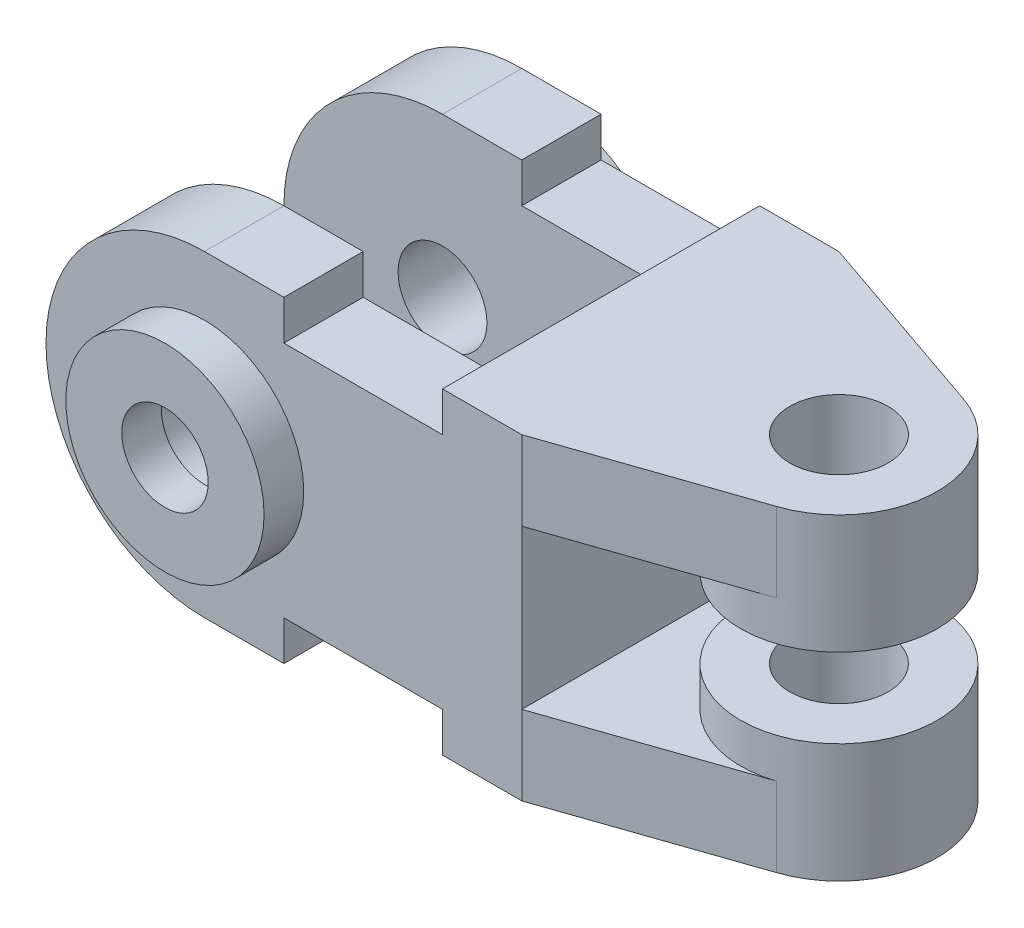
ISO-10303-21;
HEADER;
FILE_DESCRIPTION(('STEP AP214'),'2;1');
FILE_NAME('part.step','',(''),(''),'','','');
FILE_SCHEMA(('AUTOMOTIVE_DESIGN { 1 0 10303 214 1 1 1 1 }'));
ENDSEC;
DATA;
#1=APPLICATION_CONTEXT('core data for automotive mechanical design processes');
#2=APPLICATION_PROTOCOL_DEFINITION('international standard','automotive_design',2000,#1);
#3=PRODUCT_CONTEXT('',#1,'mechanical');
#4=PRODUCT('Part','Part','',(#3));
#5=PRODUCT_RELATED_PRODUCT_CATEGORY('part','',(#4));
#6=PRODUCT_DEFINITION_FORMATION('','',#4);
#7=PRODUCT_DEFINITION_CONTEXT('part definition',#1,'design');
#8=PRODUCT_DEFINITION('design','',#6,#7);
#9=PRODUCT_DEFINITION_SHAPE('','',#8);
#10=(LENGTH_UNIT() NAMED_UNIT(*) SI_UNIT(.MILLI.,.METRE.));
#11=(NAMED_UNIT(*) PLANE_ANGLE_UNIT() SI_UNIT($,.RADIAN.));
#12=(NAMED_UNIT(*) SI_UNIT($,.STERADIAN.) SOLID_ANGLE_UNIT());
#13=UNCERTAINTY_MEASURE_WITH_UNIT(LENGTH_MEASURE(1.E-05),#10,'distance_accuracy_value','');
#14=(GEOMETRIC_REPRESENTATION_CONTEXT(3) GLOBAL_UNCERTAINTY_ASSIGNED_CONTEXT((#13)) GLOBAL_UNIT_ASSIGNED_CONTEXT((#10,
#11,#12)) REPRESENTATION_CONTEXT('',''));
#15=CARTESIAN_POINT('',(0.,0.,0.));
#16=DIRECTION('',(0.,0.,1.));
#17=DIRECTION('',(1.,0.,0.));
#18=AXIS2_PLACEMENT_3D('',#15,#16,#17);
#19=CARTESIAN_POINT('',(0.,38.1,-61.375313577005));
#20=DIRECTION('',(0.,1.,0.));
#21=DIRECTION('',(-1.,0.,0.));
#22=AXIS2_PLACEMENT_3D('',#19,#20,#21);
#23=PLANE('',#22);
#24=CARTESIAN_POINT('',(41.586506056068,38.1,-0.669313577005048));
#25=DIRECTION('',(0.,-1.,0.));
#26=DIRECTION('',(1.,0.,0.));
#27=AXIS2_PLACEMENT_3D('',#24,#25,#26);
#28=CIRCLE('',#27,15.748);
#29=CARTESIAN_POINT('',(46.5529997498275,38.1,14.2750313196389));
#30=VERTEX_POINT('',#29);
#31=CARTESIAN_POINT('',(46.7129725561448,38.1,-15.5595400770819));
#32=VERTEX_POINT('',#31);
#33=EDGE_CURVE('E274',#30,#32,#28,.T.);
#34=ORIENTED_EDGE('',*,*,#33,.F.);
#35=DIRECTION('',(0.945522095075268,0.,-0.325557932977336));
#36=VECTOR('',#35,1.);
#37=CARTESIAN_POINT('',(16.186506056068,38.1,24.7306864229949));
#38=LINE('',#37,#36);
#39=CARTESIAN_POINT('',(16.186506056068,38.1,24.7306864229949));
#40=VERTEX_POINT('',#39);
#41=EDGE_CURVE('E279',#40,#30,#38,.T.);
#42=ORIENTED_EDGE('',*,*,#41,.F.);
#43=DIRECTION('',(0.,0.,1.));
#44=VECTOR('',#43,1.);
#45=CARTESIAN_POINT('',(16.186506056068,38.1,-61.375313577005));
#46=LINE('',#45,#44);
#47=CARTESIAN_POINT('',(16.186506056068,38.1,-26.0693135770051));
#48=VERTEX_POINT('',#47);
#49=EDGE_CURVE('E277',#48,#40,#46,.T.);
#50=ORIENTED_EDGE('',*,*,#49,.F.);
#51=DIRECTION('',(-0.945531273817426,0.,-0.325531273817426));
#52=VECTOR('',#51,1.);
#53=CARTESIAN_POINT('',(16.186506056068,38.1,-26.0693135770051));
#54=LINE('',#53,#52);
#55=EDGE_CURVE('E262',#32,#48,#54,.T.);
#56=ORIENTED_EDGE('',*,*,#55,.F.);
#57=EDGE_LOOP('',(#34,#42,#50,#56));
#58=FACE_BOUND('',#57,.T.);
#59=ADVANCED_FACE('F82',(#58),#23,.F.);
#60=CARTESIAN_POINT('',(0.,12.7,-61.375313577005));
#61=DIRECTION('',(0.,-1.,0.));
#62=DIRECTION('',(0.,0.,-1.));
#63=AXIS2_PLACEMENT_3D('',#60,#61,#62);
#64=PLANE('',#63);
#65=CARTESIAN_POINT('',(41.586506056068,12.7,-0.669313577005048));
#66=DIRECTION('',(0.,-1.,0.));
#67=DIRECTION('',(0.,0.,-1.));
#68=AXIS2_PLACEMENT_3D('',#65,#66,#67);
#69=CIRCLE('',#68,15.748);
#70=CARTESIAN_POINT('',(46.7129725561448,12.7,-15.5595400770819));
#71=VERTEX_POINT('',#70);
#72=CARTESIAN_POINT('',(46.5529997498267,12.7,14.2750313196391));
#73=VERTEX_POINT('',#72);
#74=EDGE_CURVE('E12',#71,#73,#69,.F.);
#75=ORIENTED_EDGE('',*,*,#74,.F.);
#76=DIRECTION('',(0.945531273817426,0.,0.325531273817426));
#77=VECTOR('',#76,1.);
#78=CARTESIAN_POINT('',(16.186506056068,12.7,-26.0693135770051));
#79=LINE('',#78,#77);
#80=CARTESIAN_POINT('',(16.186506056068,12.7,-26.0693135770051));
#81=VERTEX_POINT('',#80);
#82=EDGE_CURVE('E403',#81,#71,#79,.T.);
#83=ORIENTED_EDGE('',*,*,#82,.F.);
#84=DIRECTION('',(0.,0.,1.));
#85=VECTOR('',#84,1.);
#86=CARTESIAN_POINT('',(16.186506056068,12.7,-61.375313577005));
#87=LINE('',#86,#85);
#88=CARTESIAN_POINT('',(16.186506056068,12.7,24.7306864229949));
#89=VERTEX_POINT('',#88);
#90=EDGE_CURVE('E342',#81,#89,#87,.T.);
#91=ORIENTED_EDGE('',*,*,#90,.T.);
#92=DIRECTION('',(-0.945522095075268,0.,0.325557932977336));
#93=VECTOR('',#92,1.);
#94=CARTESIAN_POINT('',(16.186506056068,12.7,24.7306864229949));
#95=LINE('',#94,#93);
#96=EDGE_CURVE('E407',#73,#89,#95,.T.);
#97=ORIENTED_EDGE('',*,*,#96,.F.);
#98=EDGE_LOOP('',(#75,#83,#91,#97));
#99=FACE_BOUND('',#98,.T.);
#100=ADVANCED_FACE('F573',(#99),#64,.F.);
#101=CARTESIAN_POINT('',(-60.013493943932,50.8,-26.0693135770051));
#102=DIRECTION('',(0.,0.,1.));
#103=DIRECTION('',(1.,0.,0.));
#104=AXIS2_PLACEMENT_3D('',#101,#102,#103);
#105=PLANE('',#104);
#106=DIRECTION('',(-1.,0.,0.));
#107=VECTOR('',#106,1.);
#108=CARTESIAN_POINT('',(-60.013493943932,0.,-26.0693135770051));
#109=LINE('',#108,#107);
#110=CARTESIAN_POINT('',(-21.913493943932,0.,-26.0693135770051));
#111=VERTEX_POINT('',#110);
#112=CARTESIAN_POINT('',(-34.613493943932,0.,-26.0693135770051));
#113=VERTEX_POINT('',#112);
#114=EDGE_CURVE('E518',#111,#113,#109,.T.);
#115=ORIENTED_EDGE('',*,*,#114,.T.);
#116=CARTESIAN_POINT('',(-34.613493943932,25.4,-26.0693135770051));
#117=DIRECTION('',(0.,0.,1.));
#118=DIRECTION('',(1.,0.,0.));
#119=AXIS2_PLACEMENT_3D('',#116,#117,#118);
#120=CIRCLE('',#119,25.4);
#121=CARTESIAN_POINT('',(-34.613493943932,50.8,-26.0693135770051));
#122=VERTEX_POINT('',#121);
#123=EDGE_CURVE('E553',#122,#113,#120,.T.);
#124=ORIENTED_EDGE('',*,*,#123,.F.);
#125=DIRECTION('',(-1.,0.,0.));
#126=VECTOR('',#125,1.);
#127=CARTESIAN_POINT('',(-60.013493943932,50.8,-26.0693135770051));
#128=LINE('',#127,#126);
#129=CARTESIAN_POINT('',(-21.913493943932,50.8,-26.0693135770051));
#130=VERTEX_POINT('',#129);
#131=EDGE_CURVE('E487',#130,#122,#128,.T.);
#132=ORIENTED_EDGE('',*,*,#131,.F.);
#133=DIRECTION('',(0.,-1.,0.));
#134=VECTOR('',#133,1.);
#135=CARTESIAN_POINT('',(-21.913493943932,50.8,-26.0693135770051));
#136=LINE('',#135,#134);
#137=CARTESIAN_POINT('',(-21.913493943932,44.45,-26.0693135770051));
#138=VERTEX_POINT('',#137);
#139=EDGE_CURVE('E549',#130,#138,#136,.T.);
#140=ORIENTED_EDGE('',*,*,#139,.T.);
#141=DIRECTION('',(1.,0.,0.));
#142=VECTOR('',#141,1.);
#143=CARTESIAN_POINT('',(-60.013493943932,44.45,-26.0693135770051));
#144=LINE('',#143,#142);
#145=CARTESIAN_POINT('',(3.48650605606802,44.45,-26.0693135770051));
#146=VERTEX_POINT('',#145);
#147=EDGE_CURVE('E545',#138,#146,#144,.T.);
#148=ORIENTED_EDGE('',*,*,#147,.T.);
#149=DIRECTION('',(0.,1.,0.));
#150=VECTOR('',#149,1.);
#151=CARTESIAN_POINT('',(3.48650605606802,50.8,-26.0693135770051));
#152=LINE('',#151,#150);
#153=CARTESIAN_POINT('',(3.48650605606799,50.8,-26.0693135770051));
#154=VERTEX_POINT('',#153);
#155=EDGE_CURVE('E541',#146,#154,#152,.T.);
#156=ORIENTED_EDGE('',*,*,#155,.T.);
#157=CARTESIAN_POINT('',(16.186506056068,50.8,-26.0693135770051));
#158=VERTEX_POINT('',#157);
#159=EDGE_CURVE('E488',#158,#154,#128,.T.);
#160=ORIENTED_EDGE('',*,*,#159,.F.);
#161=DIRECTION('',(0.,-1.,0.));
#162=VECTOR('',#161,1.);
#163=CARTESIAN_POINT('',(16.186506056068,50.8,-26.0693135770051));
#164=LINE('',#163,#162);
#165=EDGE_CURVE('E522',#158,#48,#164,.T.);
#166=ORIENTED_EDGE('',*,*,#165,.T.);
#167=EDGE_CURVE('E524',#48,#81,#164,.T.);
#168=ORIENTED_EDGE('',*,*,#167,.T.);
#169=CARTESIAN_POINT('',(16.186506056068,0.,-26.0693135770051));
#170=VERTEX_POINT('',#169);
#171=EDGE_CURVE('E492',#81,#170,#164,.T.);
#172=ORIENTED_EDGE('',*,*,#171,.T.);
#173=CARTESIAN_POINT('',(3.48650605606803,0.,-26.0693135770051));
#174=VERTEX_POINT('',#173);
#175=EDGE_CURVE('E468',#170,#174,#109,.T.);
#176=ORIENTED_EDGE('',*,*,#175,.T.);
#177=DIRECTION('',(0.,-1.,0.));
#178=VECTOR('',#177,1.);
#179=CARTESIAN_POINT('',(3.48650605606802,50.8,-26.0693135770051));
#180=LINE('',#179,#178);
#181=CARTESIAN_POINT('',(3.48650605606802,6.35,-26.0693135770051));
#182=VERTEX_POINT('',#181);
#183=EDGE_CURVE('E331',#182,#174,#180,.T.);
#184=ORIENTED_EDGE('',*,*,#183,.F.);
#185=DIRECTION('',(1.,0.,0.));
#186=VECTOR('',#185,1.);
#187=CARTESIAN_POINT('',(-60.013493943932,6.35,-26.0693135770051));
#188=LINE('',#187,#186);
#189=CARTESIAN_POINT('',(-21.913493943932,6.35,-26.0693135770051));
#190=VERTEX_POINT('',#189);
#191=EDGE_CURVE('E556',#190,#182,#188,.T.);
#192=ORIENTED_EDGE('',*,*,#191,.F.);
#193=DIRECTION('',(0.,1.,0.));
#194=VECTOR('',#193,1.);
#195=CARTESIAN_POINT('',(-21.9134939439319,50.8,-26.0693135770051));
#196=LINE('',#195,#194);
#197=EDGE_CURVE('E559',#111,#190,#196,.T.);
#198=ORIENTED_EDGE('',*,*,#197,.F.);
#199=EDGE_LOOP('',(#115,#124,#132,#140,#148,#156,#160,#166,#168,#172,#176,#184,#192,#198));
#200=FACE_BOUND('',#199,.T.);
#201=CARTESIAN_POINT('',(-34.613493943932,25.4,-26.0693135770051));
#202=DIRECTION('',(0.,0.,1.));
#203=DIRECTION('',(1.,0.,0.));
#204=AXIS2_PLACEMENT_3D('',#201,#202,#203);
#205=CIRCLE('',#204,15.875);
#206=CARTESIAN_POINT('',(-18.738493943932,25.4,-26.0693135770051));
#207=VERTEX_POINT('',#206);
#208=EDGE_CURVE('E91',#207,#207,#205,.F.);
#209=ORIENTED_EDGE('',*,*,#208,.F.);
#210=EDGE_LOOP('',(#209));
#211=FACE_BOUND('',#210,.T.);
#212=ADVANCED_FACE('F571',(#200,#211),#105,.F.);
#213=CARTESIAN_POINT('',(-60.013493943932,50.8,-13.3693135770051));
#214=DIRECTION('',(0.,0.,-1.));
#215=DIRECTION('',(-1.,0.,0.));
#216=AXIS2_PLACEMENT_3D('',#213,#214,#215);
#217=PLANE('',#216);
#218=CARTESIAN_POINT('',(-34.613493943932,25.4,-13.369313577005));
#219=DIRECTION('',(0.,0.,-1.));
#220=DIRECTION('',(-1.,0.,0.));
#221=AXIS2_PLACEMENT_3D('',#218,#219,#220);
#222=CIRCLE('',#221,7.11200000000001);
#223=CARTESIAN_POINT('',(-41.725493943932,25.4,-13.369313577005));
#224=VERTEX_POINT('',#223);
#225=EDGE_CURVE('E450',#224,#224,#222,.T.);
#226=ORIENTED_EDGE('',*,*,#225,.T.);
#227=EDGE_LOOP('',(#226));
#228=FACE_BOUND('',#227,.T.);
#229=CARTESIAN_POINT('',(-34.613493943932,25.4,-13.369313577005));
#230=DIRECTION('',(0.,0.,-1.));
#231=DIRECTION('',(-1.,0.,0.));
#232=AXIS2_PLACEMENT_3D('',#229,#230,#231);
#233=CIRCLE('',#232,25.4);
#234=CARTESIAN_POINT('',(-34.613493943932,0.,-13.369313577005));
#235=VERTEX_POINT('',#234);
#236=CARTESIAN_POINT('',(-34.613493943932,50.8,-13.369313577005));
#237=VERTEX_POINT('',#236);
#238=EDGE_CURVE('E430',#235,#237,#233,.T.);
#239=ORIENTED_EDGE('',*,*,#238,.F.);
#240=DIRECTION('',(1.,0.,0.));
#241=VECTOR('',#240,1.);
#242=CARTESIAN_POINT('',(-60.013493943932,0.,-13.3693135770051));
#243=LINE('',#242,#241);
#244=CARTESIAN_POINT('',(-21.913493943932,0.,-13.369313577005));
#245=VERTEX_POINT('',#244);
#246=EDGE_CURVE('E459',#235,#245,#243,.T.);
#247=ORIENTED_EDGE('',*,*,#246,.T.);
#248=DIRECTION('',(0.,-1.,0.));
#249=VECTOR('',#248,1.);
#250=CARTESIAN_POINT('',(-21.9134939439319,50.8,-13.3693135770051));
#251=LINE('',#250,#249);
#252=CARTESIAN_POINT('',(-21.913493943932,6.35,-13.369313577005));
#253=VERTEX_POINT('',#252);
#254=EDGE_CURVE('E442',#253,#245,#251,.T.);
#255=ORIENTED_EDGE('',*,*,#254,.F.);
#256=DIRECTION('',(-1.,0.,0.));
#257=VECTOR('',#256,1.);
#258=CARTESIAN_POINT('',(-60.013493943932,6.35,-13.3693135770051));
#259=LINE('',#258,#257);
#260=CARTESIAN_POINT('',(3.48650605606802,6.35,-13.369313577005));
#261=VERTEX_POINT('',#260);
#262=EDGE_CURVE('E436',#261,#253,#259,.T.);
#263=ORIENTED_EDGE('',*,*,#262,.F.);
#264=DIRECTION('',(0.,-1.,0.));
#265=VECTOR('',#264,1.);
#266=CARTESIAN_POINT('',(3.48650605606803,50.8,-13.3693135770051));
#267=LINE('',#266,#265);
#268=CARTESIAN_POINT('',(3.48650605606802,44.45,-13.369313577005));
#269=VERTEX_POINT('',#268);
#270=EDGE_CURVE('E537',#269,#261,#267,.T.);
#271=ORIENTED_EDGE('',*,*,#270,.F.);
#272=DIRECTION('',(-1.,0.,0.));
#273=VECTOR('',#272,1.);
#274=CARTESIAN_POINT('',(-60.013493943932,44.45,-13.3693135770051));
#275=LINE('',#274,#273);
#276=CARTESIAN_POINT('',(-21.913493943932,44.45,-13.369313577005));
#277=VERTEX_POINT('',#276);
#278=EDGE_CURVE('E423',#269,#277,#275,.T.);
#279=ORIENTED_EDGE('',*,*,#278,.T.);
#280=DIRECTION('',(0.,1.,0.));
#281=VECTOR('',#280,1.);
#282=CARTESIAN_POINT('',(-21.913493943932,50.8,-13.3693135770051));
#283=LINE('',#282,#281);
#284=CARTESIAN_POINT('',(-21.913493943932,50.8,-13.369313577005));
#285=VERTEX_POINT('',#284);
#286=EDGE_CURVE('E415',#277,#285,#283,.T.);
#287=ORIENTED_EDGE('',*,*,#286,.T.);
#288=DIRECTION('',(1.,0.,0.));
#289=VECTOR('',#288,1.);
#290=CARTESIAN_POINT('',(-60.013493943932,50.8,-13.3693135770051));
#291=LINE('',#290,#289);
#292=EDGE_CURVE('E463',#237,#285,#291,.T.);
#293=ORIENTED_EDGE('',*,*,#292,.F.);
#294=EDGE_LOOP('',(#239,#247,#255,#263,#271,#279,#287,#293));
#295=FACE_BOUND('',#294,.T.);
#296=ADVANCED_FACE('F84',(#228,#295),#217,.F.);
#297=CARTESIAN_POINT('',(-60.013493943932,50.8,12.0306864229949));
#298=DIRECTION('',(0.,0.,1.));
#299=DIRECTION('',(1.,0.,0.));
#300=AXIS2_PLACEMENT_3D('',#297,#298,#299);
#301=PLANE('',#300);
#302=CARTESIAN_POINT('',(-34.613493943932,25.4,12.0306864229949));
#303=DIRECTION('',(0.,0.,1.));
#304=DIRECTION('',(1.,0.,0.));
#305=AXIS2_PLACEMENT_3D('',#302,#303,#304);
#306=CIRCLE('',#305,7.11200000000001);
#307=CARTESIAN_POINT('',(-27.501493943932,25.4,12.0306864229949));
#308=VERTEX_POINT('',#307);
#309=EDGE_CURVE('E446',#308,#308,#306,.T.);
#310=ORIENTED_EDGE('',*,*,#309,.T.);
#311=EDGE_LOOP('',(#310));
#312=FACE_BOUND('',#311,.T.);
#313=DIRECTION('',(-1.,0.,0.));
#314=VECTOR('',#313,1.);
#315=CARTESIAN_POINT('',(-60.013493943932,0.,12.0306864229949));
#316=LINE('',#315,#314);
#317=CARTESIAN_POINT('',(-21.913493943932,0.,12.0306864229949));
#318=VERTEX_POINT('',#317);
#319=CARTESIAN_POINT('',(-34.613493943932,0.,12.0306864229949));
#320=VERTEX_POINT('',#319);
#321=EDGE_CURVE('E498',#318,#320,#316,.T.);
#322=ORIENTED_EDGE('',*,*,#321,.T.);
#323=CARTESIAN_POINT('',(-34.613493943932,25.4,12.0306864229949));
#324=DIRECTION('',(0.,0.,1.));
#325=DIRECTION('',(1.,0.,0.));
#326=AXIS2_PLACEMENT_3D('',#323,#324,#325);
#327=CIRCLE('',#326,25.4);
#328=CARTESIAN_POINT('',(-34.613493943932,50.8,12.0306864229949));
#329=VERTEX_POINT('',#328);
#330=EDGE_CURVE('E427',#329,#320,#327,.T.);
#331=ORIENTED_EDGE('',*,*,#330,.F.);
#332=DIRECTION('',(-1.,0.,0.));
#333=VECTOR('',#332,1.);
#334=CARTESIAN_POINT('',(-60.013493943932,50.8,12.0306864229949));
#335=LINE('',#334,#333);
#336=CARTESIAN_POINT('',(-21.913493943932,50.8,12.0306864229949));
#337=VERTEX_POINT('',#336);
#338=EDGE_CURVE('E471',#337,#329,#335,.T.);
#339=ORIENTED_EDGE('',*,*,#338,.F.);
#340=DIRECTION('',(0.,-1.,0.));
#341=VECTOR('',#340,1.);
#342=CARTESIAN_POINT('',(-21.913493943932,50.8,12.0306864229949));
#343=LINE('',#342,#341);
#344=CARTESIAN_POINT('',(-21.913493943932,44.45,12.0306864229949));
#345=VERTEX_POINT('',#344);
#346=EDGE_CURVE('E411',#337,#345,#343,.T.);
#347=ORIENTED_EDGE('',*,*,#346,.T.);
#348=DIRECTION('',(1.,0.,0.));
#349=VECTOR('',#348,1.);
#350=CARTESIAN_POINT('',(-60.013493943932,44.45,12.0306864229949));
#351=LINE('',#350,#349);
#352=CARTESIAN_POINT('',(3.48650605606802,44.45,12.0306864229949));
#353=VERTEX_POINT('',#352);
#354=EDGE_CURVE('E419',#345,#353,#351,.T.);
#355=ORIENTED_EDGE('',*,*,#354,.T.);
#356=DIRECTION('',(0.,-1.,0.));
#357=VECTOR('',#356,1.);
#358=CARTESIAN_POINT('',(3.48650605606803,50.8,12.0306864229949));
#359=LINE('',#358,#357);
#360=CARTESIAN_POINT('',(3.48650605606802,6.35,12.0306864229949));
#361=VERTEX_POINT('',#360);
#362=EDGE_CURVE('E533',#353,#361,#359,.T.);
#363=ORIENTED_EDGE('',*,*,#362,.T.);
#364=DIRECTION('',(1.,0.,0.));
#365=VECTOR('',#364,1.);
#366=CARTESIAN_POINT('',(-60.013493943932,6.35,12.0306864229949));
#367=LINE('',#366,#365);
#368=CARTESIAN_POINT('',(-21.913493943932,6.35,12.0306864229949));
#369=VERTEX_POINT('',#368);
#370=EDGE_CURVE('E433',#369,#361,#367,.T.);
#371=ORIENTED_EDGE('',*,*,#370,.F.);
#372=DIRECTION('',(0.,1.,0.));
#373=VECTOR('',#372,1.);
#374=CARTESIAN_POINT('',(-21.9134939439319,50.8,12.0306864229949));
#375=LINE('',#374,#373);
#376=EDGE_CURVE('E439',#318,#369,#375,.T.);
#377=ORIENTED_EDGE('',*,*,#376,.F.);
#378=EDGE_LOOP('',(#322,#331,#339,#347,#355,#363,#371,#377));
#379=FACE_BOUND('',#378,.T.);
#380=ADVANCED_FACE('F580',(#312,#379),#301,.F.);
#381=CARTESIAN_POINT('',(-60.013493943932,50.8,24.7306864229949));
#382=DIRECTION('',(0.,0.,-1.));
#383=DIRECTION('',(-1.,0.,0.));
#384=AXIS2_PLACEMENT_3D('',#381,#382,#383);
#385=PLANE('',#384);
#386=CARTESIAN_POINT('',(-34.613493943932,25.4,24.7306864229949));
#387=DIRECTION('',(0.,0.,1.));
#388=DIRECTION('',(1.,0.,0.));
#389=AXIS2_PLACEMENT_3D('',#386,#387,#388);
#390=CIRCLE('',#389,15.875);
#391=CARTESIAN_POINT('',(-18.738493943932,25.4,24.7306864229949));
#392=VERTEX_POINT('',#391);
#393=EDGE_CURVE('E327',#392,#392,#390,.T.);
#394=ORIENTED_EDGE('',*,*,#393,.F.);
#395=EDGE_LOOP('',(#394));
#396=FACE_BOUND('',#395,.T.);
#397=CARTESIAN_POINT('',(-34.613493943932,25.4,24.7306864229949));
#398=DIRECTION('',(0.,0.,1.));
#399=DIRECTION('',(1.,0.,0.));
#400=AXIS2_PLACEMENT_3D('',#397,#398,#399);
#401=CIRCLE('',#400,25.4);
#402=CARTESIAN_POINT('',(-34.613493943932,50.8,24.7306864229949));
#403=VERTEX_POINT('',#402);
#404=CARTESIAN_POINT('',(-34.613493943932,0.,24.7306864229949));
#405=VERTEX_POINT('',#404);
#406=EDGE_CURVE('E347',#403,#405,#401,.T.);
#407=ORIENTED_EDGE('',*,*,#406,.T.);
#408=DIRECTION('',(1.,0.,0.));
#409=VECTOR('',#408,1.);
#410=CARTESIAN_POINT('',(-60.013493943932,0.,24.7306864229949));
#411=LINE('',#410,#409);
#412=CARTESIAN_POINT('',(-21.913493943932,0.,24.7306864229949));
#413=VERTEX_POINT('',#412);
#414=EDGE_CURVE('E503',#405,#413,#411,.T.);
#415=ORIENTED_EDGE('',*,*,#414,.T.);
#416=DIRECTION('',(0.,1.,0.));
#417=VECTOR('',#416,1.);
#418=CARTESIAN_POINT('',(-21.913493943932,0.,24.7306864229949));
#419=LINE('',#418,#417);
#420=CARTESIAN_POINT('',(-21.913493943932,6.35,24.7306864229949));
#421=VERTEX_POINT('',#420);
#422=EDGE_CURVE('E363',#413,#421,#419,.T.);
#423=ORIENTED_EDGE('',*,*,#422,.T.);
#424=DIRECTION('',(1.,0.,0.));
#425=VECTOR('',#424,1.);
#426=CARTESIAN_POINT('',(0.,6.35,24.7306864229949));
#427=LINE('',#426,#425);
#428=CARTESIAN_POINT('',(3.48650605606803,6.35,24.7306864229949));
#429=VERTEX_POINT('',#428);
#430=EDGE_CURVE('E359',#421,#429,#427,.T.);
#431=ORIENTED_EDGE('',*,*,#430,.T.);
#432=DIRECTION('',(0.,-1.,0.));
#433=VECTOR('',#432,1.);
#434=CARTESIAN_POINT('',(3.48650605606803,0.,24.7306864229949));
#435=LINE('',#434,#433);
#436=CARTESIAN_POINT('',(3.48650605606803,0.,24.7306864229949));
#437=VERTEX_POINT('',#436);
#438=EDGE_CURVE('E98',#429,#437,#435,.T.);
#439=ORIENTED_EDGE('',*,*,#438,.T.);
#440=CARTESIAN_POINT('',(16.186506056068,0.,24.7306864229949));
#441=VERTEX_POINT('',#440);
#442=EDGE_CURVE('E502',#437,#441,#411,.T.);
#443=ORIENTED_EDGE('',*,*,#442,.T.);
#444=DIRECTION('',(0.,-1.,0.));
#445=VECTOR('',#444,1.);
#446=CARTESIAN_POINT('',(16.186506056068,50.8,24.7306864229949));
#447=LINE('',#446,#445);
#448=EDGE_CURVE('E528',#89,#441,#447,.T.);
#449=ORIENTED_EDGE('',*,*,#448,.F.);
#450=DIRECTION('',(0.,1.,0.));
#451=VECTOR('',#450,1.);
#452=CARTESIAN_POINT('',(16.186506056068,0.,24.7306864229949));
#453=LINE('',#452,#451);
#454=EDGE_CURVE('E337',#89,#40,#453,.T.);
#455=ORIENTED_EDGE('',*,*,#454,.T.);
#456=CARTESIAN_POINT('',(16.186506056068,50.8,24.7306864229949));
#457=VERTEX_POINT('',#456);
#458=EDGE_CURVE('E529',#457,#40,#447,.T.);
#459=ORIENTED_EDGE('',*,*,#458,.F.);
#460=DIRECTION('',(1.,0.,0.));
#461=VECTOR('',#460,1.);
#462=CARTESIAN_POINT('',(-60.013493943932,50.8,24.7306864229949));
#463=LINE('',#462,#461);
#464=CARTESIAN_POINT('',(3.48650605606802,50.8,24.7306864229949));
#465=VERTEX_POINT('',#464);
#466=EDGE_CURVE('E475',#465,#457,#463,.T.);
#467=ORIENTED_EDGE('',*,*,#466,.F.);
#468=DIRECTION('',(0.,1.,0.));
#469=VECTOR('',#468,1.);
#470=CARTESIAN_POINT('',(3.48650605606803,0.,24.7306864229949));
#471=LINE('',#470,#469);
#472=CARTESIAN_POINT('',(3.48650605606803,44.45,24.7306864229949));
#473=VERTEX_POINT('',#472);
#474=EDGE_CURVE('E382',#473,#465,#471,.T.);
#475=ORIENTED_EDGE('',*,*,#474,.F.);
#476=DIRECTION('',(1.,0.,0.));
#477=VECTOR('',#476,1.);
#478=CARTESIAN_POINT('',(0.,44.45,24.7306864229949));
#479=LINE('',#478,#477);
#480=CARTESIAN_POINT('',(-21.913493943932,44.45,24.7306864229949));
#481=VERTEX_POINT('',#480);
#482=EDGE_CURVE('E106',#481,#473,#479,.T.);
#483=ORIENTED_EDGE('',*,*,#482,.F.);
#484=DIRECTION('',(0.,-1.,0.));
#485=VECTOR('',#484,1.);
#486=CARTESIAN_POINT('',(-21.913493943932,0.,24.7306864229949));
#487=LINE('',#486,#485);
#488=CARTESIAN_POINT('',(-21.913493943932,50.8,24.7306864229949));
#489=VERTEX_POINT('',#488);
#490=EDGE_CURVE('E386',#489,#481,#487,.T.);
#491=ORIENTED_EDGE('',*,*,#490,.F.);
#492=EDGE_CURVE('E478',#403,#489,#463,.T.);
#493=ORIENTED_EDGE('',*,*,#492,.F.);
#494=EDGE_LOOP('',(#407,#415,#423,#431,#439,#443,#449,#455,#459,#467,#475,#483,#491,#493));
#495=FACE_BOUND('',#494,.T.);
#496=ADVANCED_FACE('F672',(#396,#495),#385,.F.);
#497=CARTESIAN_POINT('',(41.586506056068,50.8,-0.669313577005048));
#498=DIRECTION('',(0.,-1.,0.));
#499=DIRECTION('',(0.,0.,-1.));
#500=AXIS2_PLACEMENT_3D('',#497,#498,#499);
#501=PLANE('',#500);
#502=ORIENTED_EDGE('',*,*,#131,.T.);
#503=DIRECTION('',(0.,0.,1.));
#504=VECTOR('',#503,1.);
#505=CARTESIAN_POINT('',(-34.613493943932,50.8,-61.375313577005));
#506=LINE('',#505,#504);
#507=EDGE_CURVE('E341',#122,#237,#506,.T.);
#508=ORIENTED_EDGE('',*,*,#507,.T.);
#509=ORIENTED_EDGE('',*,*,#292,.T.);
#510=DIRECTION('',(0.,0.,1.));
#511=VECTOR('',#510,1.);
#512=CARTESIAN_POINT('',(-21.913493943932,50.8,-61.375313577005));
#513=LINE('',#512,#511);
#514=EDGE_CURVE('E394',#130,#285,#513,.T.);
#515=ORIENTED_EDGE('',*,*,#514,.F.);
#516=EDGE_LOOP('',(#502,#508,#509,#515));
#517=FACE_BOUND('',#516,.T.);
#518=ADVANCED_FACE('F633',(#517),#501,.F.);
#519=ORIENTED_EDGE('',*,*,#338,.T.);
#520=EDGE_CURVE('E350',#329,#403,#506,.T.);
#521=ORIENTED_EDGE('',*,*,#520,.T.);
#522=ORIENTED_EDGE('',*,*,#492,.T.);
#523=EDGE_CURVE('E395',#337,#489,#513,.T.);
#524=ORIENTED_EDGE('',*,*,#523,.F.);
#525=EDGE_LOOP('',(#519,#521,#522,#524));
#526=FACE_BOUND('',#525,.T.);
#527=ADVANCED_FACE('F634',(#526),#501,.F.);
#528=CARTESIAN_POINT('',(41.586506056068,0.,-0.669313577005048));
#529=DIRECTION('',(0.,-1.,0.));
#530=DIRECTION('',(0.,0.,-1.));
#531=AXIS2_PLACEMENT_3D('',#528,#529,#530);
#532=PLANE('',#531);
#533=CARTESIAN_POINT('',(41.586506056068,0.,-0.669313577005048));
#534=DIRECTION('',(0.,1.,0.));
#535=DIRECTION('',(0.,0.,1.));
#536=AXIS2_PLACEMENT_3D('',#533,#534,#535);
#537=CIRCLE('',#536,7.874);
#538=CARTESIAN_POINT('',(41.586506056068,0.,7.20468642299495));
#539=VERTEX_POINT('',#538);
#540=EDGE_CURVE('E454',#539,#539,#537,.T.);
#541=ORIENTED_EDGE('',*,*,#540,.T.);
#542=EDGE_LOOP('',(#541));
#543=FACE_BOUND('',#542,.T.);
#544=ORIENTED_EDGE('',*,*,#442,.F.);
#545=DIRECTION('',(0.,0.,1.));
#546=VECTOR('',#545,1.);
#547=CARTESIAN_POINT('',(3.48650605606803,0.,-13.3693135770051));
#548=LINE('',#547,#546);
#549=EDGE_CURVE('E495',#174,#437,#548,.T.);
#550=ORIENTED_EDGE('',*,*,#549,.F.);
#551=ORIENTED_EDGE('',*,*,#175,.F.);
#552=DIRECTION('',(-0.945531273817426,0.,-0.325531273817426));
#553=VECTOR('',#552,1.);
#554=CARTESIAN_POINT('',(16.186506056068,0.,-26.0693135770051));
#555=LINE('',#554,#553);
#556=CARTESIAN_POINT('',(46.7129725561448,0.,-15.5595400770819));
#557=VERTEX_POINT('',#556);
#558=EDGE_CURVE('E514',#557,#170,#555,.T.);
#559=ORIENTED_EDGE('',*,*,#558,.F.);
#560=CARTESIAN_POINT('',(41.586506056068,0.,-0.669313577005048));
#561=DIRECTION('',(0.,1.,0.));
#562=DIRECTION('',(0.,0.,-1.));
#563=AXIS2_PLACEMENT_3D('',#560,#561,#562);
#564=CIRCLE('',#563,15.748);
#565=CARTESIAN_POINT('',(46.5529997498275,0.,14.2750313196389));
#566=VERTEX_POINT('',#565);
#567=EDGE_CURVE('E510',#566,#557,#564,.T.);
#568=ORIENTED_EDGE('',*,*,#567,.F.);
#569=DIRECTION('',(0.945522095075268,0.,-0.325557932977336));
#570=VECTOR('',#569,1.);
#571=CARTESIAN_POINT('',(16.186506056068,0.,24.7306864229949));
#572=LINE('',#571,#570);
#573=EDGE_CURVE('E506',#441,#566,#572,.T.);
#574=ORIENTED_EDGE('',*,*,#573,.F.);
#575=EDGE_LOOP('',(#544,#550,#551,#559,#568,#574));
#576=FACE_BOUND('',#575,.T.);
#577=ADVANCED_FACE('F635',(#543,#576),#532,.T.);
#578=DIRECTION('',(0.,0.,1.));
#579=VECTOR('',#578,1.);
#580=CARTESIAN_POINT('',(-34.613493943932,0.,-61.375313577005));
#581=LINE('',#580,#579);
#582=EDGE_CURVE('E336',#113,#235,#581,.T.);
#583=ORIENTED_EDGE('',*,*,#582,.F.);
#584=ORIENTED_EDGE('',*,*,#114,.F.);
#585=DIRECTION('',(0.,0.,1.));
#586=VECTOR('',#585,1.);
#587=CARTESIAN_POINT('',(-21.913493943932,0.,-61.375313577005));
#588=LINE('',#587,#586);
#589=EDGE_CURVE('E372',#111,#245,#588,.T.);
#590=ORIENTED_EDGE('',*,*,#589,.T.);
#591=ORIENTED_EDGE('',*,*,#246,.F.);
#592=EDGE_LOOP('',(#583,#584,#590,#591));
#593=FACE_BOUND('',#592,.T.);
#594=ADVANCED_FACE('F637',(#593),#532,.T.);
#595=EDGE_CURVE('E332',#320,#405,#581,.T.);
#596=ORIENTED_EDGE('',*,*,#595,.F.);
#597=ORIENTED_EDGE('',*,*,#321,.F.);
#598=EDGE_CURVE('E368',#318,#413,#588,.T.);
#599=ORIENTED_EDGE('',*,*,#598,.T.);
#600=ORIENTED_EDGE('',*,*,#414,.F.);
#601=EDGE_LOOP('',(#596,#597,#599,#600));
#602=FACE_BOUND('',#601,.T.);
#603=ADVANCED_FACE('F639',(#602),#532,.T.);
#604=CARTESIAN_POINT('',(16.186506056068,50.8,24.7306864229949));
#605=DIRECTION('',(-0.325557932977336,0.,-0.945522095075268));
#606=DIRECTION('',(-0.945522095075268,0.,0.325557932977336));
#607=AXIS2_PLACEMENT_3D('',#604,#605,#606);
#608=PLANE('',#607);
#609=DIRECTION('',(0.,-1.,0.));
#610=VECTOR('',#609,1.);
#611=CARTESIAN_POINT('',(46.5529997498275,50.8,14.2750313196389));
#612=LINE('',#611,#610);
#613=EDGE_CURVE('E269',#73,#566,#612,.T.);
#614=ORIENTED_EDGE('',*,*,#613,.F.);
#615=ORIENTED_EDGE('',*,*,#96,.T.);
#616=ORIENTED_EDGE('',*,*,#448,.T.);
#617=ORIENTED_EDGE('',*,*,#573,.T.);
#618=EDGE_LOOP('',(#614,#615,#616,#617));
#619=FACE_BOUND('',#618,.T.);
#620=ADVANCED_FACE('F648',(#619),#608,.F.);
#621=CARTESIAN_POINT('',(41.586506056068,50.8,-0.669313577005048));
#622=DIRECTION('',(0.,-1.,0.));
#623=DIRECTION('',(0.,0.,-1.));
#624=AXIS2_PLACEMENT_3D('',#621,#622,#623);
#625=CYLINDRICAL_SURFACE('',#624,15.748);
#626=DIRECTION('',(0.,-1.,0.));
#627=VECTOR('',#626,1.);
#628=CARTESIAN_POINT('',(46.7129725561448,50.8,-15.5595400770819));
#629=LINE('',#628,#627);
#630=EDGE_CURVE('E270',#71,#557,#629,.T.);
#631=ORIENTED_EDGE('',*,*,#630,.F.);
#632=ORIENTED_EDGE('',*,*,#74,.T.);
#633=ORIENTED_EDGE('',*,*,#613,.T.);
#634=ORIENTED_EDGE('',*,*,#567,.T.);
#635=EDGE_LOOP('',(#631,#632,#633,#634));
#636=FACE_BOUND('',#635,.T.);
#637=CARTESIAN_POINT('',(41.586506056068,19.05,-0.669313577005048));
#638=DIRECTION('',(0.,1.,0.));
#639=DIRECTION('',(0.,0.,1.));
#640=AXIS2_PLACEMENT_3D('',#637,#638,#639);
#641=CIRCLE('',#640,15.748);
#642=CARTESIAN_POINT('',(41.586506056068,19.05,15.078686422995));
#643=VERTEX_POINT('',#642);
#644=EDGE_CURVE('E302',#643,#643,#641,.T.);
#645=ORIENTED_EDGE('',*,*,#644,.F.);
#646=EDGE_LOOP('',(#645));
#647=FACE_BOUND('',#646,.T.);
#648=ADVANCED_FACE('F653',(#636,#647),#625,.T.);
#649=CARTESIAN_POINT('',(16.186506056068,50.8,-26.0693135770051));
#650=DIRECTION('',(-0.325531273817426,0.,0.945531273817426));
#651=DIRECTION('',(0.945531273817426,0.,0.325531273817426));
#652=AXIS2_PLACEMENT_3D('',#649,#650,#651);
#653=PLANE('',#652);
#654=ORIENTED_EDGE('',*,*,#171,.F.);
#655=ORIENTED_EDGE('',*,*,#82,.T.);
#656=ORIENTED_EDGE('',*,*,#630,.T.);
#657=ORIENTED_EDGE('',*,*,#558,.T.);
#658=EDGE_LOOP('',(#654,#655,#656,#657));
#659=FACE_BOUND('',#658,.T.);
#660=ADVANCED_FACE('F766',(#659),#653,.F.);
#661=CARTESIAN_POINT('',(41.586506056068,50.8,-0.669313577005048));
#662=DIRECTION('',(0.,-1.,0.));
#663=DIRECTION('',(0.,0.,-1.));
#664=AXIS2_PLACEMENT_3D('',#661,#662,#663);
#665=CYLINDRICAL_SURFACE('',#664,7.874);
#666=ORIENTED_EDGE('',*,*,#540,.F.);
#667=EDGE_LOOP('',(#666));
#668=FACE_BOUND('',#667,.T.);
#669=CARTESIAN_POINT('',(41.586506056068,19.05,-0.669313577005048));
#670=DIRECTION('',(0.,1.,0.));
#671=DIRECTION('',(0.,0.,1.));
#672=AXIS2_PLACEMENT_3D('',#669,#670,#671);
#673=CIRCLE('',#672,7.874);
#674=CARTESIAN_POINT('',(41.586506056068,19.05,7.20468642299495));
#675=VERTEX_POINT('',#674);
#676=EDGE_CURVE('E294',#675,#675,#673,.T.);
#677=ORIENTED_EDGE('',*,*,#676,.T.);
#678=EDGE_LOOP('',(#677));
#679=FACE_BOUND('',#678,.T.);
#680=ADVANCED_FACE('F628',(#668,#679),#665,.F.);
#681=ORIENTED_EDGE('',*,*,#159,.T.);
#682=DIRECTION('',(0.,0.,1.));
#683=VECTOR('',#682,1.);
#684=CARTESIAN_POINT('',(3.48650605606803,50.8,-13.3693135770051));
#685=LINE('',#684,#683);
#686=EDGE_CURVE('E467',#154,#465,#685,.T.);
#687=ORIENTED_EDGE('',*,*,#686,.T.);
#688=ORIENTED_EDGE('',*,*,#466,.T.);
#689=DIRECTION('',(0.945522095075268,0.,-0.325557932977336));
#690=VECTOR('',#689,1.);
#691=CARTESIAN_POINT('',(16.186506056068,50.8,24.7306864229949));
#692=LINE('',#691,#690);
#693=CARTESIAN_POINT('',(46.5529997498275,50.8,14.2750313196389));
#694=VERTEX_POINT('',#693);
#695=EDGE_CURVE('E479',#457,#694,#692,.T.);
#696=ORIENTED_EDGE('',*,*,#695,.T.);
#697=CARTESIAN_POINT('',(41.586506056068,50.8,-0.669313577005048));
#698=DIRECTION('',(0.,1.,0.));
#699=DIRECTION('',(0.,0.,-1.));
#700=AXIS2_PLACEMENT_3D('',#697,#698,#699);
#701=CIRCLE('',#700,15.748);
#702=CARTESIAN_POINT('',(46.7129725561448,50.8,-15.5595400770819));
#703=VERTEX_POINT('',#702);
#704=EDGE_CURVE('E482',#694,#703,#701,.T.);
#705=ORIENTED_EDGE('',*,*,#704,.T.);
#706=DIRECTION('',(-0.945531273817426,0.,-0.325531273817426));
#707=VECTOR('',#706,1.);
#708=CARTESIAN_POINT('',(16.186506056068,50.8,-26.0693135770051));
#709=LINE('',#708,#707);
#710=EDGE_CURVE('E264',#703,#158,#709,.T.);
#711=ORIENTED_EDGE('',*,*,#710,.T.);
#712=EDGE_LOOP('',(#681,#687,#688,#696,#705,#711));
#713=FACE_BOUND('',#712,.T.);
#714=CARTESIAN_POINT('',(41.586506056068,50.8,-0.669313577005048));
#715=DIRECTION('',(0.,1.,0.));
#716=DIRECTION('',(0.,0.,1.));
#717=AXIS2_PLACEMENT_3D('',#714,#715,#716);
#718=CIRCLE('',#717,7.874);
#719=CARTESIAN_POINT('',(41.586506056068,50.8,7.20468642299495));
#720=VERTEX_POINT('',#719);
#721=EDGE_CURVE('E455',#720,#720,#718,.T.);
#722=ORIENTED_EDGE('',*,*,#721,.F.);
#723=EDGE_LOOP('',(#722));
#724=FACE_BOUND('',#723,.T.);
#725=ADVANCED_FACE('F629',(#713,#724),#501,.F.);
#726=CARTESIAN_POINT('',(3.48650605606803,50.8,-13.3693135770051));
#727=DIRECTION('',(1.,0.,0.));
#728=DIRECTION('',(0.,0.,-1.));
#729=AXIS2_PLACEMENT_3D('',#726,#727,#728);
#730=PLANE('',#729);
#731=ORIENTED_EDGE('',*,*,#549,.T.);
#732=ORIENTED_EDGE('',*,*,#438,.F.);
#733=DIRECTION('',(0.,0.,1.));
#734=VECTOR('',#733,1.);
#735=CARTESIAN_POINT('',(3.48650605606802,6.35,-61.375313577005));
#736=LINE('',#735,#734);
#737=EDGE_CURVE('E367',#361,#429,#736,.T.);
#738=ORIENTED_EDGE('',*,*,#737,.F.);
#739=ORIENTED_EDGE('',*,*,#362,.F.);
#740=DIRECTION('',(0.,0.,1.));
#741=VECTOR('',#740,1.);
#742=CARTESIAN_POINT('',(3.48650605606802,44.45,-61.375313577005));
#743=LINE('',#742,#741);
#744=EDGE_CURVE('E390',#353,#473,#743,.T.);
#745=ORIENTED_EDGE('',*,*,#744,.T.);
#746=ORIENTED_EDGE('',*,*,#474,.T.);
#747=ORIENTED_EDGE('',*,*,#686,.F.);
#748=ORIENTED_EDGE('',*,*,#155,.F.);
#749=EDGE_CURVE('E398',#146,#269,#743,.T.);
#750=ORIENTED_EDGE('',*,*,#749,.T.);
#751=ORIENTED_EDGE('',*,*,#270,.T.);
#752=EDGE_CURVE('E377',#182,#261,#736,.T.);
#753=ORIENTED_EDGE('',*,*,#752,.F.);
#754=ORIENTED_EDGE('',*,*,#183,.T.);
#755=EDGE_LOOP('',(#731,#732,#738,#739,#745,#746,#747,#748,#750,#751,#753,#754));
#756=FACE_BOUND('',#755,.T.);
#757=ADVANCED_FACE('F631',(#756),#730,.F.);
#758=ORIENTED_EDGE('',*,*,#458,.T.);
#759=ORIENTED_EDGE('',*,*,#41,.T.);
#760=EDGE_CURVE('E286',#694,#30,#612,.T.);
#761=ORIENTED_EDGE('',*,*,#760,.F.);
#762=ORIENTED_EDGE('',*,*,#695,.F.);
#763=EDGE_LOOP('',(#758,#759,#761,#762));
#764=FACE_BOUND('',#763,.T.);
#765=ADVANCED_FACE('F656',(#764),#608,.F.);
#766=ORIENTED_EDGE('',*,*,#760,.T.);
#767=ORIENTED_EDGE('',*,*,#33,.T.);
#768=EDGE_CURVE('E258',#703,#32,#629,.T.);
#769=ORIENTED_EDGE('',*,*,#768,.F.);
#770=ORIENTED_EDGE('',*,*,#704,.F.);
#771=EDGE_LOOP('',(#766,#767,#769,#770));
#772=FACE_BOUND('',#771,.T.);
#773=CARTESIAN_POINT('',(41.586506056068,31.75,-0.669313577005048));
#774=DIRECTION('',(0.,-1.,0.));
#775=DIRECTION('',(1.,0.,0.));
#776=AXIS2_PLACEMENT_3D('',#773,#774,#775);
#777=CIRCLE('',#776,15.748);
#778=CARTESIAN_POINT('',(57.334506056068,31.75,-0.669313577005048));
#779=VERTEX_POINT('',#778);
#780=EDGE_CURVE('E288',#779,#779,#777,.T.);
#781=ORIENTED_EDGE('',*,*,#780,.F.);
#782=EDGE_LOOP('',(#781));
#783=FACE_BOUND('',#782,.T.);
#784=ADVANCED_FACE('F283',(#772,#783),#625,.T.);
#785=ORIENTED_EDGE('',*,*,#768,.T.);
#786=ORIENTED_EDGE('',*,*,#55,.T.);
#787=ORIENTED_EDGE('',*,*,#165,.F.);
#788=ORIENTED_EDGE('',*,*,#710,.F.);
#789=EDGE_LOOP('',(#785,#786,#787,#788));
#790=FACE_BOUND('',#789,.T.);
#791=ADVANCED_FACE('F260',(#790),#653,.F.);
#792=ORIENTED_EDGE('',*,*,#721,.T.);
#793=EDGE_LOOP('',(#792));
#794=FACE_BOUND('',#793,.T.);
#795=CARTESIAN_POINT('',(41.586506056068,31.75,-0.669313577005048));
#796=DIRECTION('',(0.,-1.,0.));
#797=DIRECTION('',(1.,0.,0.));
#798=AXIS2_PLACEMENT_3D('',#795,#796,#797);
#799=CIRCLE('',#798,7.87399999999999);
#800=CARTESIAN_POINT('',(49.460506056068,31.75,-0.669313577005048));
#801=VERTEX_POINT('',#800);
#802=EDGE_CURVE('E289',#801,#801,#799,.T.);
#803=ORIENTED_EDGE('',*,*,#802,.T.);
#804=EDGE_LOOP('',(#803));
#805=FACE_BOUND('',#804,.T.);
#806=ADVANCED_FACE('F624',(#794,#805),#665,.F.);
#807=CARTESIAN_POINT('',(16.186506056068,0.,-61.375313577005));
#808=DIRECTION('',(1.,0.,0.));
#809=DIRECTION('',(0.,0.,-1.));
#810=AXIS2_PLACEMENT_3D('',#807,#808,#809);
#811=PLANE('',#810);
#812=ORIENTED_EDGE('',*,*,#167,.F.);
#813=ORIENTED_EDGE('',*,*,#49,.T.);
#814=ORIENTED_EDGE('',*,*,#454,.F.);
#815=ORIENTED_EDGE('',*,*,#90,.F.);
#816=EDGE_LOOP('',(#812,#813,#814,#815));
#817=FACE_BOUND('',#816,.T.);
#818=ADVANCED_FACE('F593',(#817),#811,.T.);
#819=CARTESIAN_POINT('',(-21.913493943932,0.,-61.375313577005));
#820=DIRECTION('',(-1.,0.,0.));
#821=DIRECTION('',(0.,0.,1.));
#822=AXIS2_PLACEMENT_3D('',#819,#820,#821);
#823=PLANE('',#822);
#824=DIRECTION('',(0.,0.,1.));
#825=VECTOR('',#824,1.);
#826=CARTESIAN_POINT('',(-21.913493943932,44.45,-61.375313577005));
#827=LINE('',#826,#825);
#828=EDGE_CURVE('E280',#138,#277,#827,.T.);
#829=ORIENTED_EDGE('',*,*,#828,.F.);
#830=ORIENTED_EDGE('',*,*,#139,.F.);
#831=ORIENTED_EDGE('',*,*,#514,.T.);
#832=ORIENTED_EDGE('',*,*,#286,.F.);
#833=EDGE_LOOP('',(#829,#830,#831,#832));
#834=FACE_BOUND('',#833,.T.);
#835=ADVANCED_FACE('F616',(#834),#823,.F.);
#836=CARTESIAN_POINT('',(0.,44.45,-61.375313577005));
#837=DIRECTION('',(0.,-1.,0.));
#838=DIRECTION('',(0.,0.,-1.));
#839=AXIS2_PLACEMENT_3D('',#836,#837,#838);
#840=PLANE('',#839);
#841=ORIENTED_EDGE('',*,*,#749,.F.);
#842=ORIENTED_EDGE('',*,*,#147,.F.);
#843=ORIENTED_EDGE('',*,*,#828,.T.);
#844=ORIENTED_EDGE('',*,*,#278,.F.);
#845=EDGE_LOOP('',(#841,#842,#843,#844));
#846=FACE_BOUND('',#845,.T.);
#847=ADVANCED_FACE('F598',(#846),#840,.F.);
#848=CARTESIAN_POINT('',(-34.613493943932,25.4,-61.375313577005));
#849=DIRECTION('',(0.,0.,1.));
#850=DIRECTION('',(1.,0.,0.));
#851=AXIS2_PLACEMENT_3D('',#848,#849,#850);
#852=CYLINDRICAL_SURFACE('',#851,25.4);
#853=ORIENTED_EDGE('',*,*,#238,.T.);
#854=ORIENTED_EDGE('',*,*,#507,.F.);
#855=ORIENTED_EDGE('',*,*,#123,.T.);
#856=ORIENTED_EDGE('',*,*,#582,.T.);
#857=EDGE_LOOP('',(#853,#854,#855,#856));
#858=FACE_BOUND('',#857,.T.);
#859=ADVANCED_FACE('F594',(#858),#852,.T.);
#860=CARTESIAN_POINT('',(0.,6.35,-61.375313577005));
#861=DIRECTION('',(0.,-1.,0.));
#862=DIRECTION('',(0.,0.,-1.));
#863=AXIS2_PLACEMENT_3D('',#860,#861,#862);
#864=PLANE('',#863);
#865=ORIENTED_EDGE('',*,*,#262,.T.);
#866=DIRECTION('',(0.,0.,1.));
#867=VECTOR('',#866,1.);
#868=CARTESIAN_POINT('',(-21.913493943932,6.35,-61.375313577005));
#869=LINE('',#868,#867);
#870=EDGE_CURVE('E373',#190,#253,#869,.T.);
#871=ORIENTED_EDGE('',*,*,#870,.F.);
#872=ORIENTED_EDGE('',*,*,#191,.T.);
#873=ORIENTED_EDGE('',*,*,#752,.T.);
#874=EDGE_LOOP('',(#865,#871,#872,#873));
#875=FACE_BOUND('',#874,.T.);
#876=ADVANCED_FACE('F597',(#875),#864,.T.);
#877=CARTESIAN_POINT('',(-21.913493943932,0.,-61.375313577005));
#878=DIRECTION('',(1.,0.,0.));
#879=DIRECTION('',(0.,1.,0.));
#880=AXIS2_PLACEMENT_3D('',#877,#878,#879);
#881=PLANE('',#880);
#882=ORIENTED_EDGE('',*,*,#254,.T.);
#883=ORIENTED_EDGE('',*,*,#589,.F.);
#884=ORIENTED_EDGE('',*,*,#197,.T.);
#885=ORIENTED_EDGE('',*,*,#870,.T.);
#886=EDGE_LOOP('',(#882,#883,#884,#885));
#887=FACE_BOUND('',#886,.T.);
#888=ADVANCED_FACE('F605',(#887),#881,.T.);
#889=CARTESIAN_POINT('',(-34.613493943932,25.4,-61.375313577005));
#890=DIRECTION('',(0.,0.,1.));
#891=DIRECTION('',(1.,0.,0.));
#892=AXIS2_PLACEMENT_3D('',#889,#890,#891);
#893=CYLINDRICAL_SURFACE('',#892,7.11200000000001);
#894=ORIENTED_EDGE('',*,*,#225,.F.);
#895=EDGE_LOOP('',(#894));
#896=FACE_BOUND('',#895,.T.);
#897=CARTESIAN_POINT('',(-34.613493943932,25.4,-32.4193135770051));
#898=DIRECTION('',(0.,0.,-1.));
#899=DIRECTION('',(-1.,0.,0.));
#900=AXIS2_PLACEMENT_3D('',#897,#898,#899);
#901=CIRCLE('',#900,7.11200000000001);
#902=CARTESIAN_POINT('',(-41.725493943932,25.4,-32.4193135770051));
#903=VERTEX_POINT('',#902);
#904=EDGE_CURVE('E306',#903,#903,#901,.T.);
#905=ORIENTED_EDGE('',*,*,#904,.T.);
#906=EDGE_LOOP('',(#905));
#907=FACE_BOUND('',#906,.T.);
#908=ADVANCED_FACE('F601',(#896,#907),#893,.F.);
#909=EDGE_CURVE('E391',#345,#481,#827,.T.);
#910=ORIENTED_EDGE('',*,*,#909,.T.);
#911=ORIENTED_EDGE('',*,*,#482,.T.);
#912=ORIENTED_EDGE('',*,*,#744,.F.);
#913=ORIENTED_EDGE('',*,*,#354,.F.);
#914=EDGE_LOOP('',(#910,#911,#912,#913));
#915=FACE_BOUND('',#914,.T.);
#916=ADVANCED_FACE('F604',(#915),#840,.F.);
#917=ORIENTED_EDGE('',*,*,#523,.T.);
#918=ORIENTED_EDGE('',*,*,#490,.T.);
#919=ORIENTED_EDGE('',*,*,#909,.F.);
#920=ORIENTED_EDGE('',*,*,#346,.F.);
#921=EDGE_LOOP('',(#917,#918,#919,#920));
#922=FACE_BOUND('',#921,.T.);
#923=ADVANCED_FACE('F620',(#922),#823,.F.);
#924=ORIENTED_EDGE('',*,*,#330,.T.);
#925=ORIENTED_EDGE('',*,*,#595,.T.);
#926=ORIENTED_EDGE('',*,*,#406,.F.);
#927=ORIENTED_EDGE('',*,*,#520,.F.);
#928=EDGE_LOOP('',(#924,#925,#926,#927));
#929=FACE_BOUND('',#928,.T.);
#930=ADVANCED_FACE('F600',(#929),#852,.T.);
#931=ORIENTED_EDGE('',*,*,#376,.T.);
#932=EDGE_CURVE('E374',#369,#421,#869,.T.);
#933=ORIENTED_EDGE('',*,*,#932,.T.);
#934=ORIENTED_EDGE('',*,*,#422,.F.);
#935=ORIENTED_EDGE('',*,*,#598,.F.);
#936=EDGE_LOOP('',(#931,#933,#934,#935));
#937=FACE_BOUND('',#936,.T.);
#938=ADVANCED_FACE('F611',(#937),#881,.T.);
#939=ORIENTED_EDGE('',*,*,#370,.T.);
#940=ORIENTED_EDGE('',*,*,#737,.T.);
#941=ORIENTED_EDGE('',*,*,#430,.F.);
#942=ORIENTED_EDGE('',*,*,#932,.F.);
#943=EDGE_LOOP('',(#939,#940,#941,#942));
#944=FACE_BOUND('',#943,.T.);
#945=ADVANCED_FACE('F615',(#944),#864,.T.);
#946=CARTESIAN_POINT('',(-34.613493943932,25.4,24.7306864229949));
#947=DIRECTION('',(0.,0.,1.));
#948=DIRECTION('',(1.,0.,0.));
#949=AXIS2_PLACEMENT_3D('',#946,#947,#948);
#950=CIRCLE('',#949,7.11200000000001);
#951=CARTESIAN_POINT('',(-27.501493943932,25.4,24.7306864229949));
#952=VERTEX_POINT('',#951);
#953=EDGE_CURVE('E326',#952,#952,#950,.T.);
#954=ORIENTED_EDGE('',*,*,#953,.T.);
#955=EDGE_LOOP('',(#954));
#956=FACE_BOUND('',#955,.T.);
#957=ORIENTED_EDGE('',*,*,#309,.F.);
#958=EDGE_LOOP('',(#957));
#959=FACE_BOUND('',#958,.T.);
#960=ADVANCED_FACE('F607',(#956,#959),#893,.F.);
#961=CARTESIAN_POINT('',(-34.613493943932,25.4,31.0806864229949));
#962=DIRECTION('',(0.,0.,1.));
#963=DIRECTION('',(1.,0.,0.));
#964=AXIS2_PLACEMENT_3D('',#961,#962,#963);
#965=PLANE('',#964);
#966=CARTESIAN_POINT('',(-34.613493943932,25.4,31.0806864229949));
#967=DIRECTION('',(0.,0.,1.));
#968=DIRECTION('',(1.,0.,0.));
#969=AXIS2_PLACEMENT_3D('',#966,#967,#968);
#970=CIRCLE('',#969,15.875);
#971=CARTESIAN_POINT('',(-18.738493943932,25.4,31.0806864229949));
#972=VERTEX_POINT('',#971);
#973=EDGE_CURVE('E319',#972,#972,#970,.T.);
#974=ORIENTED_EDGE('',*,*,#973,.T.);
#975=EDGE_LOOP('',(#974));
#976=FACE_BOUND('',#975,.T.);
#977=CARTESIAN_POINT('',(-34.613493943932,25.4,31.0806864229949));
#978=DIRECTION('',(0.,0.,1.));
#979=DIRECTION('',(1.,0.,0.));
#980=AXIS2_PLACEMENT_3D('',#977,#978,#979);
#981=CIRCLE('',#980,6.92142692750269);
#982=CARTESIAN_POINT('',(-27.6920670164293,25.4,31.0806864229949));
#983=VERTEX_POINT('',#982);
#984=EDGE_CURVE('E315',#983,#983,#981,.T.);
#985=ORIENTED_EDGE('',*,*,#984,.F.);
#986=EDGE_LOOP('',(#985));
#987=FACE_BOUND('',#986,.T.);
#988=ADVANCED_FACE('F844',(#976,#987),#965,.T.);
#989=CARTESIAN_POINT('',(-34.613493943932,25.4,24.7306864229949));
#990=DIRECTION('',(0.,0.,1.));
#991=DIRECTION('',(1.,0.,0.));
#992=AXIS2_PLACEMENT_3D('',#989,#990,#991);
#993=PLANE('',#992);
#994=ORIENTED_EDGE('',*,*,#953,.F.);
#995=EDGE_LOOP('',(#994));
#996=FACE_BOUND('',#995,.T.);
#997=CARTESIAN_POINT('',(-34.613493943932,25.4,24.7306864229949));
#998=DIRECTION('',(0.,0.,1.));
#999=DIRECTION('',(1.,0.,0.));
#1000=AXIS2_PLACEMENT_3D('',#997,#998,#999);
#1001=CIRCLE('',#1000,6.92142692750269);
#1002=CARTESIAN_POINT('',(-27.6920670164293,25.4,24.7306864229949));
#1003=VERTEX_POINT('',#1002);
#1004=EDGE_CURVE('E314',#1003,#1003,#1001,.T.);
#1005=ORIENTED_EDGE('',*,*,#1004,.T.);
#1006=EDGE_LOOP('',(#1005));
#1007=FACE_BOUND('',#1006,.T.);
#1008=ADVANCED_FACE('F851',(#996,#1007),#993,.F.);
#1009=CARTESIAN_POINT('',(-34.613493943932,25.4,31.0806864229949));
#1010=DIRECTION('',(0.,0.,-1.));
#1011=DIRECTION('',(-1.,0.,0.));
#1012=AXIS2_PLACEMENT_3D('',#1009,#1010,#1011);
#1013=CYLINDRICAL_SURFACE('',#1012,15.875);
#1014=ORIENTED_EDGE('',*,*,#973,.F.);
#1015=EDGE_LOOP('',(#1014));
#1016=FACE_BOUND('',#1015,.T.);
#1017=ORIENTED_EDGE('',*,*,#393,.T.);
#1018=EDGE_LOOP('',(#1017));
#1019=FACE_BOUND('',#1018,.T.);
#1020=ADVANCED_FACE('F859',(#1016,#1019),#1013,.T.);
#1021=CARTESIAN_POINT('',(-34.613493943932,25.4,31.0806864229949));
#1022=DIRECTION('',(0.,0.,-1.));
#1023=DIRECTION('',(-1.,0.,0.));
#1024=AXIS2_PLACEMENT_3D('',#1021,#1022,#1023);
#1025=CYLINDRICAL_SURFACE('',#1024,6.92142692750269);
#1026=ORIENTED_EDGE('',*,*,#984,.T.);
#1027=EDGE_LOOP('',(#1026));
#1028=FACE_BOUND('',#1027,.T.);
#1029=ORIENTED_EDGE('',*,*,#1004,.F.);
#1030=EDGE_LOOP('',(#1029));
#1031=FACE_BOUND('',#1030,.T.);
#1032=ADVANCED_FACE('F867',(#1028,#1031),#1025,.F.);
#1033=CARTESIAN_POINT('',(-34.613493943932,25.4,-32.4193135770051));
#1034=DIRECTION('',(0.,0.,-1.));
#1035=DIRECTION('',(-1.,0.,0.));
#1036=AXIS2_PLACEMENT_3D('',#1033,#1034,#1035);
#1037=PLANE('',#1036);
#1038=CARTESIAN_POINT('',(-34.613493943932,25.4,-32.4193135770051));
#1039=DIRECTION('',(0.,0.,-1.));
#1040=DIRECTION('',(-1.,0.,0.));
#1041=AXIS2_PLACEMENT_3D('',#1038,#1039,#1040);
#1042=CIRCLE('',#1041,15.875);
#1043=CARTESIAN_POINT('',(-50.488493943932,25.4,-32.4193135770051));
#1044=VERTEX_POINT('',#1043);
#1045=EDGE_CURVE('E310',#1044,#1044,#1042,.T.);
#1046=ORIENTED_EDGE('',*,*,#1045,.T.);
#1047=EDGE_LOOP('',(#1046));
#1048=FACE_BOUND('',#1047,.T.);
#1049=ORIENTED_EDGE('',*,*,#904,.F.);
#1050=EDGE_LOOP('',(#1049));
#1051=FACE_BOUND('',#1050,.T.);
#1052=ADVANCED_FACE('F875',(#1048,#1051),#1037,.T.);
#1053=CARTESIAN_POINT('',(-34.613493943932,25.4,-32.4193135770051));
#1054=DIRECTION('',(0.,0.,1.));
#1055=DIRECTION('',(1.,0.,0.));
#1056=AXIS2_PLACEMENT_3D('',#1053,#1054,#1055);
#1057=CYLINDRICAL_SURFACE('',#1056,15.875);
#1058=ORIENTED_EDGE('',*,*,#1045,.F.);
#1059=EDGE_LOOP('',(#1058));
#1060=FACE_BOUND('',#1059,.T.);
#1061=ORIENTED_EDGE('',*,*,#208,.T.);
#1062=EDGE_LOOP('',(#1061));
#1063=FACE_BOUND('',#1062,.T.);
#1064=ADVANCED_FACE('F569',(#1060,#1063),#1057,.T.);
#1065=CARTESIAN_POINT('',(41.586506056068,19.05,-0.669313577005048));
#1066=DIRECTION('',(0.,1.,0.));
#1067=DIRECTION('',(0.,0.,1.));
#1068=AXIS2_PLACEMENT_3D('',#1065,#1066,#1067);
#1069=PLANE('',#1068);
#1070=ORIENTED_EDGE('',*,*,#644,.T.);
#1071=EDGE_LOOP('',(#1070));
#1072=FACE_BOUND('',#1071,.T.);
#1073=ORIENTED_EDGE('',*,*,#676,.F.);
#1074=EDGE_LOOP('',(#1073));
#1075=FACE_BOUND('',#1074,.T.);
#1076=ADVANCED_FACE('F889',(#1072,#1075),#1069,.T.);
#1077=CARTESIAN_POINT('',(41.586506056068,31.75,-0.669313577005048));
#1078=DIRECTION('',(0.,-1.,0.));
#1079=DIRECTION('',(1.,0.,0.));
#1080=AXIS2_PLACEMENT_3D('',#1077,#1078,#1079);
#1081=PLANE('',#1080);
#1082=ORIENTED_EDGE('',*,*,#780,.T.);
#1083=EDGE_LOOP('',(#1082));
#1084=FACE_BOUND('',#1083,.T.);
#1085=ORIENTED_EDGE('',*,*,#802,.F.);
#1086=EDGE_LOOP('',(#1085));
#1087=FACE_BOUND('',#1086,.T.);
#1088=ADVANCED_FACE('F898',(#1084,#1087),#1081,.T.);
#1089=CLOSED_SHELL('',(#59,#100,#212,#296,#380,#496,#518,#527,#577,#594,#603,#620,#648,#660,
#680,#725,#757,#765,#784,#791,#806,#818,#835,#847,#859,#876,#888,#908,#916,#923,#930,#938,#945,
#960,#988,#1008,#1020,#1032,#1052,#1064,#1076,#1088));
#1090=MANIFOLD_SOLID_BREP('B2',#1089);
#1091=ADVANCED_BREP_SHAPE_REPRESENTATION('',(#18,#1090),#14);
#1092=SHAPE_DEFINITION_REPRESENTATION(#9,#1091);
ENDSEC;
END-ISO-10303-21;
